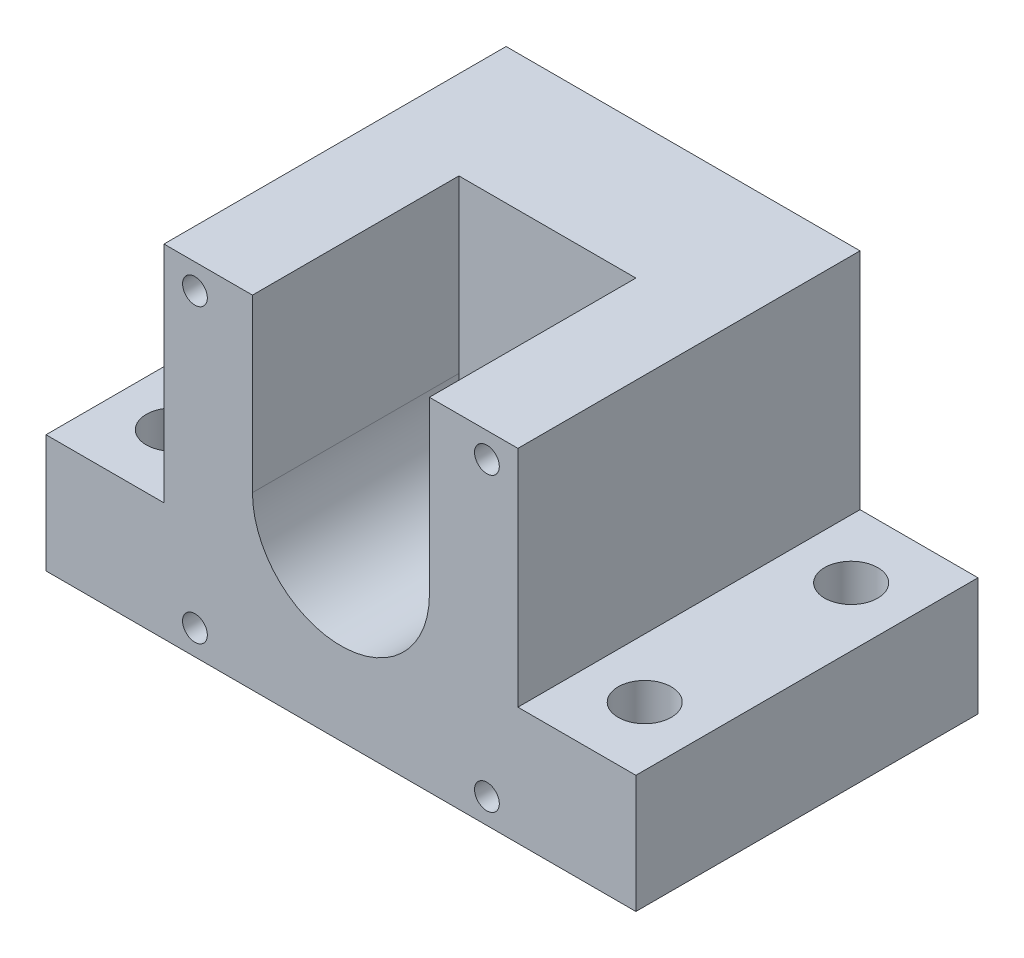
ISO-10303-21;
HEADER;
FILE_DESCRIPTION(('STEP AP214'),'2;1');
FILE_NAME('part.step','',(''),(''),'','','');
FILE_SCHEMA(('AUTOMOTIVE_DESIGN { 1 0 10303 214 1 1 1 1 }'));
ENDSEC;
DATA;
#1=APPLICATION_CONTEXT('core data for automotive mechanical design processes');
#2=APPLICATION_PROTOCOL_DEFINITION('international standard','automotive_design',2000,#1);
#3=PRODUCT_CONTEXT('',#1,'mechanical');
#4=PRODUCT('Part','Part','',(#3));
#5=PRODUCT_RELATED_PRODUCT_CATEGORY('part','',(#4));
#6=PRODUCT_DEFINITION_FORMATION('','',#4);
#7=PRODUCT_DEFINITION_CONTEXT('part definition',#1,'design');
#8=PRODUCT_DEFINITION('design','',#6,#7);
#9=PRODUCT_DEFINITION_SHAPE('','',#8);
#10=(LENGTH_UNIT() NAMED_UNIT(*) SI_UNIT(.MILLI.,.METRE.));
#11=(NAMED_UNIT(*) PLANE_ANGLE_UNIT() SI_UNIT($,.RADIAN.));
#12=(NAMED_UNIT(*) SI_UNIT($,.STERADIAN.) SOLID_ANGLE_UNIT());
#13=UNCERTAINTY_MEASURE_WITH_UNIT(LENGTH_MEASURE(1.E-05),#10,'distance_accuracy_value','');
#14=(GEOMETRIC_REPRESENTATION_CONTEXT(3) GLOBAL_UNCERTAINTY_ASSIGNED_CONTEXT((#13)) GLOBAL_UNIT_ASSIGNED_CONTEXT((#10,
#11,#12)) REPRESENTATION_CONTEXT('',''));
#15=CARTESIAN_POINT('',(0.,0.,0.));
#16=DIRECTION('',(0.,0.,1.));
#17=DIRECTION('',(1.,0.,0.));
#18=AXIS2_PLACEMENT_3D('',#15,#16,#17);
#19=CARTESIAN_POINT('',(50.,58.,0.));
#20=DIRECTION('',(-1.,0.,0.));
#21=DIRECTION('',(0.,0.,1.));
#22=AXIS2_PLACEMENT_3D('',#19,#20,#21);
#23=PLANE('',#22);
#24=DIRECTION('',(0.,0.,1.));
#25=VECTOR('',#24,1.);
#26=CARTESIAN_POINT('',(50.,20.,-58.));
#27=LINE('',#26,#25);
#28=CARTESIAN_POINT('',(50.,20.,-58.));
#29=VERTEX_POINT('',#28);
#30=CARTESIAN_POINT('',(50.,20.,0.));
#31=VERTEX_POINT('',#30);
#32=EDGE_CURVE('E175',#29,#31,#27,.T.);
#33=ORIENTED_EDGE('',*,*,#32,.T.);
#34=DIRECTION('',(0.,-1.,0.));
#35=VECTOR('',#34,1.);
#36=CARTESIAN_POINT('',(50.,58.,0.));
#37=LINE('',#36,#35);
#38=CARTESIAN_POINT('',(50.,0.,0.));
#39=VERTEX_POINT('',#38);
#40=EDGE_CURVE('E44',#31,#39,#37,.T.);
#41=ORIENTED_EDGE('',*,*,#40,.T.);
#42=DIRECTION('',(0.,0.,-1.));
#43=VECTOR('',#42,1.);
#44=CARTESIAN_POINT('',(50.,0.,0.));
#45=LINE('',#44,#43);
#46=CARTESIAN_POINT('',(50.,0.,-58.));
#47=VERTEX_POINT('',#46);
#48=EDGE_CURVE('E150',#39,#47,#45,.T.);
#49=ORIENTED_EDGE('',*,*,#48,.T.);
#50=DIRECTION('',(0.,-1.,0.));
#51=VECTOR('',#50,1.);
#52=CARTESIAN_POINT('',(50.,58.,-58.));
#53=LINE('',#52,#51);
#54=EDGE_CURVE('E168',#29,#47,#53,.T.);
#55=ORIENTED_EDGE('',*,*,#54,.F.);
#56=EDGE_LOOP('',(#33,#41,#49,#55));
#57=FACE_BOUND('',#56,.T.);
#58=ADVANCED_FACE('F35',(#57),#23,.F.);
#59=CARTESIAN_POINT('',(-50.,58.,-58.));
#60=DIRECTION('',(1.,0.,0.));
#61=DIRECTION('',(0.,0.,-1.));
#62=AXIS2_PLACEMENT_3D('',#59,#60,#61);
#63=PLANE('',#62);
#64=DIRECTION('',(0.,0.,-1.));
#65=VECTOR('',#64,1.);
#66=CARTESIAN_POINT('',(-50.,20.,-58.));
#67=LINE('',#66,#65);
#68=CARTESIAN_POINT('',(-50.,20.,0.));
#69=VERTEX_POINT('',#68);
#70=CARTESIAN_POINT('',(-50.,20.,-58.));
#71=VERTEX_POINT('',#70);
#72=EDGE_CURVE('E204',#69,#71,#67,.T.);
#73=ORIENTED_EDGE('',*,*,#72,.T.);
#74=DIRECTION('',(0.,-1.,0.));
#75=VECTOR('',#74,1.);
#76=CARTESIAN_POINT('',(-50.,58.,-58.));
#77=LINE('',#76,#75);
#78=CARTESIAN_POINT('',(-50.,0.,-58.));
#79=VERTEX_POINT('',#78);
#80=EDGE_CURVE('E157',#71,#79,#77,.T.);
#81=ORIENTED_EDGE('',*,*,#80,.T.);
#82=DIRECTION('',(0.,0.,1.));
#83=VECTOR('',#82,1.);
#84=CARTESIAN_POINT('',(-50.,0.,-58.));
#85=LINE('',#84,#83);
#86=CARTESIAN_POINT('',(-50.,0.,0.));
#87=VERTEX_POINT('',#86);
#88=EDGE_CURVE('E158',#79,#87,#85,.T.);
#89=ORIENTED_EDGE('',*,*,#88,.T.);
#90=DIRECTION('',(0.,-1.,0.));
#91=VECTOR('',#90,1.);
#92=CARTESIAN_POINT('',(-50.,58.,0.));
#93=LINE('',#92,#91);
#94=EDGE_CURVE('E12',#69,#87,#93,.T.);
#95=ORIENTED_EDGE('',*,*,#94,.F.);
#96=EDGE_LOOP('',(#73,#81,#89,#95));
#97=FACE_BOUND('',#96,.T.);
#98=ADVANCED_FACE('F37',(#97),#63,.F.);
#99=CARTESIAN_POINT('',(0.,29.,-87.4264068711929));
#100=DIRECTION('',(0.,0.,1.));
#101=DIRECTION('',(1.,0.,0.));
#102=AXIS2_PLACEMENT_3D('',#99,#100,#101);
#103=CYLINDRICAL_SURFACE('',#102,15.);
#104=DIRECTION('',(0.,0.,1.));
#105=VECTOR('',#104,1.);
#106=CARTESIAN_POINT('',(-15.,29.,-76.7252920900501));
#107=LINE('',#106,#105);
#108=CARTESIAN_POINT('',(-15.,29.,-35.));
#109=VERTEX_POINT('',#108);
#110=CARTESIAN_POINT('',(-15.,29.,0.));
#111=VERTEX_POINT('',#110);
#112=EDGE_CURVE('E241',#109,#111,#107,.T.);
#113=ORIENTED_EDGE('',*,*,#112,.T.);
#114=CARTESIAN_POINT('',(0.,29.,0.));
#115=DIRECTION('',(0.,0.,1.));
#116=DIRECTION('',(1.,0.,0.));
#117=AXIS2_PLACEMENT_3D('',#114,#115,#116);
#118=CIRCLE('',#117,15.);
#119=CARTESIAN_POINT('',(15.,29.,0.));
#120=VERTEX_POINT('',#119);
#121=EDGE_CURVE('E256',#111,#120,#118,.T.);
#122=ORIENTED_EDGE('',*,*,#121,.T.);
#123=DIRECTION('',(0.,0.,1.));
#124=VECTOR('',#123,1.);
#125=CARTESIAN_POINT('',(15.,29.,-76.7252920900501));
#126=LINE('',#125,#124);
#127=CARTESIAN_POINT('',(15.,29.,-35.));
#128=VERTEX_POINT('',#127);
#129=EDGE_CURVE('E247',#128,#120,#126,.T.);
#130=ORIENTED_EDGE('',*,*,#129,.F.);
#131=CARTESIAN_POINT('',(0.,29.,-35.));
#132=DIRECTION('',(0.,0.,1.));
#133=DIRECTION('',(1.,0.,0.));
#134=AXIS2_PLACEMENT_3D('',#131,#132,#133);
#135=CIRCLE('',#134,15.);
#136=EDGE_CURVE('E259',#128,#109,#135,.F.);
#137=ORIENTED_EDGE('',*,*,#136,.T.);
#138=EDGE_LOOP('',(#113,#122,#130,#137));
#139=FACE_BOUND('',#138,.T.);
#140=ADVANCED_FACE('F289',(#139),#103,.F.);
#141=CARTESIAN_POINT('',(0.,29.,0.));
#142=DIRECTION('',(0.,0.,-1.));
#143=DIRECTION('',(-1.,0.,0.));
#144=AXIS2_PLACEMENT_3D('',#141,#142,#143);
#145=CYLINDRICAL_SURFACE('',#144,8.);
#146=CARTESIAN_POINT('',(0.,29.,-45.));
#147=DIRECTION('',(0.,0.,-1.));
#148=DIRECTION('',(-1.,0.,0.));
#149=AXIS2_PLACEMENT_3D('',#146,#147,#148);
#150=CIRCLE('',#149,8.);
#151=CARTESIAN_POINT('',(-8.,29.,-45.));
#152=VERTEX_POINT('',#151);
#153=EDGE_CURVE('E262',#152,#152,#150,.T.);
#154=ORIENTED_EDGE('',*,*,#153,.T.);
#155=EDGE_LOOP('',(#154));
#156=FACE_BOUND('',#155,.T.);
#157=CARTESIAN_POINT('',(0.,29.,-35.));
#158=DIRECTION('',(0.,0.,1.));
#159=DIRECTION('',(1.,0.,0.));
#160=AXIS2_PLACEMENT_3D('',#157,#158,#159);
#161=CIRCLE('',#160,8.);
#162=CARTESIAN_POINT('',(8.00000000000001,29.,-35.));
#163=VERTEX_POINT('',#162);
#164=EDGE_CURVE('E39',#163,#163,#161,.F.);
#165=ORIENTED_EDGE('',*,*,#164,.F.);
#166=EDGE_LOOP('',(#165));
#167=FACE_BOUND('',#166,.T.);
#168=ADVANCED_FACE('F298',(#156,#167),#145,.F.);
#169=CARTESIAN_POINT('',(50.,58.,-58.));
#170=DIRECTION('',(0.,0.,1.));
#171=DIRECTION('',(1.,0.,0.));
#172=AXIS2_PLACEMENT_3D('',#169,#170,#171);
#173=PLANE('',#172);
#174=CARTESIAN_POINT('',(24.7487373415298,53.7487373415202,-58.));
#175=DIRECTION('',(0.,0.,1.));
#176=DIRECTION('',(1.,0.,0.));
#177=AXIS2_PLACEMENT_3D('',#174,#175,#176);
#178=CIRCLE('',#177,2.09999999999999);
#179=CARTESIAN_POINT('',(26.8487373415298,53.7487373415202,-58.));
#180=VERTEX_POINT('',#179);
#181=EDGE_CURVE('E216',#180,#180,#178,.T.);
#182=ORIENTED_EDGE('',*,*,#181,.T.);
#183=EDGE_LOOP('',(#182));
#184=FACE_BOUND('',#183,.T.);
#185=CARTESIAN_POINT('',(-24.7487373415302,53.7487373415202,-58.));
#186=DIRECTION('',(0.,0.,1.));
#187=DIRECTION('',(1.,0.,0.));
#188=AXIS2_PLACEMENT_3D('',#185,#186,#187);
#189=CIRCLE('',#188,2.09999999999999);
#190=CARTESIAN_POINT('',(-22.6487373415302,53.7487373415202,-58.));
#191=VERTEX_POINT('',#190);
#192=EDGE_CURVE('E222',#191,#191,#189,.T.);
#193=ORIENTED_EDGE('',*,*,#192,.T.);
#194=EDGE_LOOP('',(#193));
#195=FACE_BOUND('',#194,.T.);
#196=CARTESIAN_POINT('',(-24.7487373415302,4.25126265847026,-58.));
#197=DIRECTION('',(0.,0.,1.));
#198=DIRECTION('',(1.,0.,0.));
#199=AXIS2_PLACEMENT_3D('',#196,#197,#198);
#200=CIRCLE('',#199,2.09999999999999);
#201=CARTESIAN_POINT('',(-22.6487373415302,4.25126265847026,-58.));
#202=VERTEX_POINT('',#201);
#203=EDGE_CURVE('E228',#202,#202,#200,.T.);
#204=ORIENTED_EDGE('',*,*,#203,.T.);
#205=EDGE_LOOP('',(#204));
#206=FACE_BOUND('',#205,.T.);
#207=CARTESIAN_POINT('',(24.7487373415298,4.25126265847026,-58.));
#208=DIRECTION('',(0.,0.,1.));
#209=DIRECTION('',(1.,0.,0.));
#210=AXIS2_PLACEMENT_3D('',#207,#208,#209);
#211=CIRCLE('',#210,2.09999999999999);
#212=CARTESIAN_POINT('',(26.8487373415298,4.25126265847026,-58.));
#213=VERTEX_POINT('',#212);
#214=EDGE_CURVE('E234',#213,#213,#211,.T.);
#215=ORIENTED_EDGE('',*,*,#214,.T.);
#216=EDGE_LOOP('',(#215));
#217=FACE_BOUND('',#216,.T.);
#218=DIRECTION('',(-1.,0.,0.));
#219=VECTOR('',#218,1.);
#220=CARTESIAN_POINT('',(50.,58.,-58.));
#221=LINE('',#220,#219);
#222=CARTESIAN_POINT('',(30.,58.,-58.));
#223=VERTEX_POINT('',#222);
#224=CARTESIAN_POINT('',(-30.,58.,-58.));
#225=VERTEX_POINT('',#224);
#226=EDGE_CURVE('E148',#223,#225,#221,.T.);
#227=ORIENTED_EDGE('',*,*,#226,.F.);
#228=DIRECTION('',(0.,1.,0.));
#229=VECTOR('',#228,1.);
#230=CARTESIAN_POINT('',(30.,-61.3514466007119,-58.));
#231=LINE('',#230,#229);
#232=CARTESIAN_POINT('',(30.,20.,-58.));
#233=VERTEX_POINT('',#232);
#234=EDGE_CURVE('E51',#233,#223,#231,.T.);
#235=ORIENTED_EDGE('',*,*,#234,.F.);
#236=DIRECTION('',(1.,0.,0.));
#237=VECTOR('',#236,1.);
#238=CARTESIAN_POINT('',(50.,20.,-58.));
#239=LINE('',#238,#237);
#240=EDGE_CURVE('E189',#233,#29,#239,.T.);
#241=ORIENTED_EDGE('',*,*,#240,.T.);
#242=ORIENTED_EDGE('',*,*,#54,.T.);
#243=DIRECTION('',(-1.,0.,0.));
#244=VECTOR('',#243,1.);
#245=CARTESIAN_POINT('',(50.,0.,-58.));
#246=LINE('',#245,#244);
#247=EDGE_CURVE('E146',#47,#79,#246,.T.);
#248=ORIENTED_EDGE('',*,*,#247,.T.);
#249=ORIENTED_EDGE('',*,*,#80,.F.);
#250=DIRECTION('',(1.,0.,0.));
#251=VECTOR('',#250,1.);
#252=CARTESIAN_POINT('',(-50.,20.,-58.));
#253=LINE('',#252,#251);
#254=CARTESIAN_POINT('',(-30.,20.,-58.));
#255=VERTEX_POINT('',#254);
#256=EDGE_CURVE('E201',#71,#255,#253,.T.);
#257=ORIENTED_EDGE('',*,*,#256,.T.);
#258=DIRECTION('',(0.,1.,0.));
#259=VECTOR('',#258,1.);
#260=CARTESIAN_POINT('',(-30.,-61.3514466007119,-58.));
#261=LINE('',#260,#259);
#262=EDGE_CURVE('E202',#255,#225,#261,.T.);
#263=ORIENTED_EDGE('',*,*,#262,.T.);
#264=EDGE_LOOP('',(#227,#235,#241,#242,#248,#249,#257,#263));
#265=FACE_BOUND('',#264,.T.);
#266=CARTESIAN_POINT('',(0.,29.,-58.));
#267=DIRECTION('',(0.,0.,1.));
#268=DIRECTION('',(1.,0.,0.));
#269=AXIS2_PLACEMENT_3D('',#266,#267,#268);
#270=CIRCLE('',#269,11.);
#271=CARTESIAN_POINT('',(-11.,29.,-58.));
#272=VERTEX_POINT('',#271);
#273=EDGE_CURVE('E154',#272,#272,#270,.T.);
#274=ORIENTED_EDGE('',*,*,#273,.T.);
#275=EDGE_LOOP('',(#274));
#276=FACE_BOUND('',#275,.T.);
#277=ADVANCED_FACE('F184',(#184,#195,#206,#217,#265,#276),#173,.F.);
#278=CARTESIAN_POINT('',(0.,58.,0.));
#279=DIRECTION('',(0.,0.,-1.));
#280=DIRECTION('',(-1.,0.,0.));
#281=AXIS2_PLACEMENT_3D('',#278,#279,#280);
#282=PLANE('',#281);
#283=CARTESIAN_POINT('',(24.7487373415298,53.7487373415202,0.));
#284=DIRECTION('',(0.,0.,1.));
#285=DIRECTION('',(1.,0.,0.));
#286=AXIS2_PLACEMENT_3D('',#283,#284,#285);
#287=CIRCLE('',#286,2.09999999999999);
#288=CARTESIAN_POINT('',(26.8487373415298,53.7487373415202,0.));
#289=VERTEX_POINT('',#288);
#290=EDGE_CURVE('E213',#289,#289,#287,.T.);
#291=ORIENTED_EDGE('',*,*,#290,.F.);
#292=EDGE_LOOP('',(#291));
#293=FACE_BOUND('',#292,.T.);
#294=CARTESIAN_POINT('',(-24.7487373415302,53.7487373415202,0.));
#295=DIRECTION('',(0.,0.,1.));
#296=DIRECTION('',(1.,0.,0.));
#297=AXIS2_PLACEMENT_3D('',#294,#295,#296);
#298=CIRCLE('',#297,2.09999999999999);
#299=CARTESIAN_POINT('',(-22.6487373415302,53.7487373415202,0.));
#300=VERTEX_POINT('',#299);
#301=EDGE_CURVE('E219',#300,#300,#298,.T.);
#302=ORIENTED_EDGE('',*,*,#301,.F.);
#303=EDGE_LOOP('',(#302));
#304=FACE_BOUND('',#303,.T.);
#305=CARTESIAN_POINT('',(-24.7487373415302,4.25126265847026,0.));
#306=DIRECTION('',(0.,0.,1.));
#307=DIRECTION('',(1.,0.,0.));
#308=AXIS2_PLACEMENT_3D('',#305,#306,#307);
#309=CIRCLE('',#308,2.09999999999999);
#310=CARTESIAN_POINT('',(-22.6487373415302,4.25126265847026,0.));
#311=VERTEX_POINT('',#310);
#312=EDGE_CURVE('E225',#311,#311,#309,.T.);
#313=ORIENTED_EDGE('',*,*,#312,.F.);
#314=EDGE_LOOP('',(#313));
#315=FACE_BOUND('',#314,.T.);
#316=CARTESIAN_POINT('',(24.7487373415298,4.25126265847026,0.));
#317=DIRECTION('',(0.,0.,1.));
#318=DIRECTION('',(1.,0.,0.));
#319=AXIS2_PLACEMENT_3D('',#316,#317,#318);
#320=CIRCLE('',#319,2.09999999999999);
#321=CARTESIAN_POINT('',(26.8487373415298,4.25126265847026,0.));
#322=VERTEX_POINT('',#321);
#323=EDGE_CURVE('E231',#322,#322,#320,.T.);
#324=ORIENTED_EDGE('',*,*,#323,.F.);
#325=EDGE_LOOP('',(#324));
#326=FACE_BOUND('',#325,.T.);
#327=DIRECTION('',(-1.,0.,0.));
#328=VECTOR('',#327,1.);
#329=CARTESIAN_POINT('',(50.,20.,0.));
#330=LINE('',#329,#328);
#331=CARTESIAN_POINT('',(30.,20.,0.));
#332=VERTEX_POINT('',#331);
#333=EDGE_CURVE('E139',#31,#332,#330,.T.);
#334=ORIENTED_EDGE('',*,*,#333,.T.);
#335=DIRECTION('',(0.,1.,0.));
#336=VECTOR('',#335,1.);
#337=CARTESIAN_POINT('',(30.,-61.3514466007119,0.));
#338=LINE('',#337,#336);
#339=CARTESIAN_POINT('',(30.,58.,0.));
#340=VERTEX_POINT('',#339);
#341=EDGE_CURVE('E125',#332,#340,#338,.T.);
#342=ORIENTED_EDGE('',*,*,#341,.T.);
#343=DIRECTION('',(1.,0.,0.));
#344=VECTOR('',#343,1.);
#345=CARTESIAN_POINT('',(-50.,58.,0.));
#346=LINE('',#345,#344);
#347=CARTESIAN_POINT('',(15.,58.,0.));
#348=VERTEX_POINT('',#347);
#349=EDGE_CURVE('E137',#348,#340,#346,.T.);
#350=ORIENTED_EDGE('',*,*,#349,.F.);
#351=DIRECTION('',(0.,1.,0.));
#352=VECTOR('',#351,1.);
#353=CARTESIAN_POINT('',(15.,58.,0.));
#354=LINE('',#353,#352);
#355=EDGE_CURVE('E237',#120,#348,#354,.T.);
#356=ORIENTED_EDGE('',*,*,#355,.F.);
#357=ORIENTED_EDGE('',*,*,#121,.F.);
#358=DIRECTION('',(0.,-1.,0.));
#359=VECTOR('',#358,1.);
#360=CARTESIAN_POINT('',(-15.,29.,0.));
#361=LINE('',#360,#359);
#362=CARTESIAN_POINT('',(-15.,58.,0.));
#363=VERTEX_POINT('',#362);
#364=EDGE_CURVE('E245',#363,#111,#361,.T.);
#365=ORIENTED_EDGE('',*,*,#364,.F.);
#366=CARTESIAN_POINT('',(-30.,58.,0.));
#367=VERTEX_POINT('',#366);
#368=EDGE_CURVE('E145',#367,#363,#346,.T.);
#369=ORIENTED_EDGE('',*,*,#368,.F.);
#370=DIRECTION('',(0.,1.,0.));
#371=VECTOR('',#370,1.);
#372=CARTESIAN_POINT('',(-30.,-61.3514466007119,0.));
#373=LINE('',#372,#371);
#374=CARTESIAN_POINT('',(-30.,20.,0.));
#375=VERTEX_POINT('',#374);
#376=EDGE_CURVE('E59',#375,#367,#373,.T.);
#377=ORIENTED_EDGE('',*,*,#376,.F.);
#378=DIRECTION('',(-1.,0.,0.));
#379=VECTOR('',#378,1.);
#380=CARTESIAN_POINT('',(-50.,20.,0.));
#381=LINE('',#380,#379);
#382=EDGE_CURVE('E207',#375,#69,#381,.T.);
#383=ORIENTED_EDGE('',*,*,#382,.T.);
#384=ORIENTED_EDGE('',*,*,#94,.T.);
#385=DIRECTION('',(1.,0.,0.));
#386=VECTOR('',#385,1.);
#387=CARTESIAN_POINT('',(0.,0.,0.));
#388=LINE('',#387,#386);
#389=EDGE_CURVE('E161',#87,#39,#388,.T.);
#390=ORIENTED_EDGE('',*,*,#389,.T.);
#391=ORIENTED_EDGE('',*,*,#40,.F.);
#392=EDGE_LOOP('',(#334,#342,#350,#356,#357,#365,#369,#377,#383,#384,#390,#391));
#393=FACE_BOUND('',#392,.T.);
#394=ADVANCED_FACE('F135',(#293,#304,#315,#326,#393),#282,.F.);
#395=CARTESIAN_POINT('',(0.,58.,0.));
#396=DIRECTION('',(0.,1.,0.));
#397=DIRECTION('',(0.,0.,1.));
#398=AXIS2_PLACEMENT_3D('',#395,#396,#397);
#399=PLANE('',#398);
#400=DIRECTION('',(0.,0.,1.));
#401=VECTOR('',#400,1.);
#402=CARTESIAN_POINT('',(30.,58.,-58.));
#403=LINE('',#402,#401);
#404=EDGE_CURVE('E122',#223,#340,#403,.T.);
#405=ORIENTED_EDGE('',*,*,#404,.F.);
#406=ORIENTED_EDGE('',*,*,#226,.T.);
#407=DIRECTION('',(0.,0.,-1.));
#408=VECTOR('',#407,1.);
#409=CARTESIAN_POINT('',(-30.,58.,-58.));
#410=LINE('',#409,#408);
#411=EDGE_CURVE('E193',#367,#225,#410,.T.);
#412=ORIENTED_EDGE('',*,*,#411,.F.);
#413=ORIENTED_EDGE('',*,*,#368,.T.);
#414=DIRECTION('',(0.,0.,1.));
#415=VECTOR('',#414,1.);
#416=CARTESIAN_POINT('',(-15.,58.,-76.7252920900501));
#417=LINE('',#416,#415);
#418=CARTESIAN_POINT('',(-15.,58.,-35.));
#419=VERTEX_POINT('',#418);
#420=EDGE_CURVE('E250',#419,#363,#417,.T.);
#421=ORIENTED_EDGE('',*,*,#420,.F.);
#422=DIRECTION('',(1.,0.,0.));
#423=VECTOR('',#422,1.);
#424=CARTESIAN_POINT('',(-15.,58.,-35.));
#425=LINE('',#424,#423);
#426=CARTESIAN_POINT('',(15.,58.,-35.));
#427=VERTEX_POINT('',#426);
#428=EDGE_CURVE('E238',#419,#427,#425,.T.);
#429=ORIENTED_EDGE('',*,*,#428,.T.);
#430=DIRECTION('',(0.,0.,1.));
#431=VECTOR('',#430,1.);
#432=CARTESIAN_POINT('',(15.,58.,-76.7252920900501));
#433=LINE('',#432,#431);
#434=EDGE_CURVE('E144',#427,#348,#433,.T.);
#435=ORIENTED_EDGE('',*,*,#434,.T.);
#436=ORIENTED_EDGE('',*,*,#349,.T.);
#437=EDGE_LOOP('',(#405,#406,#412,#413,#421,#429,#435,#436));
#438=FACE_BOUND('',#437,.T.);
#439=ADVANCED_FACE('F142',(#438),#399,.T.);
#440=CARTESIAN_POINT('',(0.,0.,0.));
#441=DIRECTION('',(0.,1.,0.));
#442=DIRECTION('',(0.,0.,1.));
#443=AXIS2_PLACEMENT_3D('',#440,#441,#442);
#444=PLANE('',#443);
#445=CARTESIAN_POINT('',(-40.,0.,-46.5));
#446=DIRECTION('',(0.,1.,0.));
#447=DIRECTION('',(0.,0.,1.));
#448=AXIS2_PLACEMENT_3D('',#445,#446,#447);
#449=CIRCLE('',#448,4.5);
#450=CARTESIAN_POINT('',(-40.,0.,-42.));
#451=VERTEX_POINT('',#450);
#452=EDGE_CURVE('E473',#451,#451,#449,.T.);
#453=ORIENTED_EDGE('',*,*,#452,.T.);
#454=EDGE_LOOP('',(#453));
#455=FACE_BOUND('',#454,.T.);
#456=CARTESIAN_POINT('',(-40.,0.,-11.5));
#457=DIRECTION('',(0.,1.,0.));
#458=DIRECTION('',(0.,0.,1.));
#459=AXIS2_PLACEMENT_3D('',#456,#457,#458);
#460=CIRCLE('',#459,4.5);
#461=CARTESIAN_POINT('',(-40.,0.,-7.00000000000001));
#462=VERTEX_POINT('',#461);
#463=EDGE_CURVE('E482',#462,#462,#460,.T.);
#464=ORIENTED_EDGE('',*,*,#463,.T.);
#465=EDGE_LOOP('',(#464));
#466=FACE_BOUND('',#465,.T.);
#467=CARTESIAN_POINT('',(40.,0.,-46.5));
#468=DIRECTION('',(0.,1.,0.));
#469=DIRECTION('',(0.,0.,1.));
#470=AXIS2_PLACEMENT_3D('',#467,#468,#469);
#471=CIRCLE('',#470,4.5);
#472=CARTESIAN_POINT('',(40.,0.,-42.));
#473=VERTEX_POINT('',#472);
#474=EDGE_CURVE('E488',#473,#473,#471,.T.);
#475=ORIENTED_EDGE('',*,*,#474,.T.);
#476=EDGE_LOOP('',(#475));
#477=FACE_BOUND('',#476,.T.);
#478=CARTESIAN_POINT('',(40.,0.,-11.5));
#479=DIRECTION('',(0.,1.,0.));
#480=DIRECTION('',(0.,0.,1.));
#481=AXIS2_PLACEMENT_3D('',#478,#479,#480);
#482=CIRCLE('',#481,4.5);
#483=CARTESIAN_POINT('',(40.,0.,-7.00000000000001));
#484=VERTEX_POINT('',#483);
#485=EDGE_CURVE('E130',#484,#484,#482,.T.);
#486=ORIENTED_EDGE('',*,*,#485,.T.);
#487=EDGE_LOOP('',(#486));
#488=FACE_BOUND('',#487,.T.);
#489=ORIENTED_EDGE('',*,*,#88,.F.);
#490=ORIENTED_EDGE('',*,*,#247,.F.);
#491=ORIENTED_EDGE('',*,*,#48,.F.);
#492=ORIENTED_EDGE('',*,*,#389,.F.);
#493=EDGE_LOOP('',(#489,#490,#491,#492));
#494=FACE_BOUND('',#493,.T.);
#495=ADVANCED_FACE('F181',(#455,#466,#477,#488,#494),#444,.F.);
#496=CARTESIAN_POINT('',(0.,29.,-45.));
#497=DIRECTION('',(0.,0.,-1.));
#498=DIRECTION('',(-1.,0.,0.));
#499=AXIS2_PLACEMENT_3D('',#496,#497,#498);
#500=CYLINDRICAL_SURFACE('',#499,11.);
#501=CARTESIAN_POINT('',(0.,29.,-45.));
#502=DIRECTION('',(0.,0.,1.));
#503=DIRECTION('',(1.,0.,0.));
#504=AXIS2_PLACEMENT_3D('',#501,#502,#503);
#505=CIRCLE('',#504,11.);
#506=CARTESIAN_POINT('',(-11.,29.,-45.));
#507=VERTEX_POINT('',#506);
#508=EDGE_CURVE('E162',#507,#507,#505,.T.);
#509=CARTESIAN_POINT('',(-11.,29.,-45.));
#510=CARTESIAN_POINT('',(-11.,29.,-45.1354166666667));
#511=CARTESIAN_POINT('',(-11.,29.,-45.2708333333333));
#512=CARTESIAN_POINT('',(-11.,29.,-45.5416666666667));
#513=CARTESIAN_POINT('',(-11.,29.,-45.6770833333333));
#514=CARTESIAN_POINT('',(-11.,29.,-45.9479166666667));
#515=CARTESIAN_POINT('',(-11.,29.,-46.0833333333333));
#516=CARTESIAN_POINT('',(-11.,29.,-46.3541666666667));
#517=CARTESIAN_POINT('',(-11.,29.,-46.4895833333333));
#518=CARTESIAN_POINT('',(-11.,29.,-46.7604166666667));
#519=CARTESIAN_POINT('',(-11.,29.,-46.8958333333333));
#520=CARTESIAN_POINT('',(-11.,29.,-47.1666666666667));
#521=CARTESIAN_POINT('',(-11.,29.,-47.3020833333333));
#522=CARTESIAN_POINT('',(-11.,29.,-47.5729166666667));
#523=CARTESIAN_POINT('',(-11.,29.,-47.7083333333333));
#524=CARTESIAN_POINT('',(-11.,29.,-47.9791666666667));
#525=CARTESIAN_POINT('',(-11.,29.,-48.1145833333333));
#526=CARTESIAN_POINT('',(-11.,29.,-48.3854166666667));
#527=CARTESIAN_POINT('',(-11.,29.,-48.5208333333333));
#528=CARTESIAN_POINT('',(-11.,29.,-48.7916666666667));
#529=CARTESIAN_POINT('',(-11.,29.,-48.9270833333333));
#530=CARTESIAN_POINT('',(-11.,29.,-49.1979166666667));
#531=CARTESIAN_POINT('',(-11.,29.,-49.3333333333333));
#532=CARTESIAN_POINT('',(-11.,29.,-49.6041666666667));
#533=CARTESIAN_POINT('',(-11.,29.,-49.7395833333333));
#534=CARTESIAN_POINT('',(-11.,29.,-50.0104166666667));
#535=CARTESIAN_POINT('',(-11.,29.,-50.1458333333333));
#536=CARTESIAN_POINT('',(-11.,29.,-50.4166666666667));
#537=CARTESIAN_POINT('',(-11.,29.,-50.5520833333333));
#538=CARTESIAN_POINT('',(-11.,29.,-50.8229166666667));
#539=CARTESIAN_POINT('',(-11.,29.,-50.9583333333333));
#540=CARTESIAN_POINT('',(-11.,29.,-51.2291666666667));
#541=CARTESIAN_POINT('',(-11.,29.,-51.3645833333333));
#542=CARTESIAN_POINT('',(-11.,29.,-51.6354166666667));
#543=CARTESIAN_POINT('',(-11.,29.,-51.7708333333333));
#544=CARTESIAN_POINT('',(-11.,29.,-52.0416666666667));
#545=CARTESIAN_POINT('',(-11.,29.,-52.1770833333333));
#546=CARTESIAN_POINT('',(-11.,29.,-52.4479166666667));
#547=CARTESIAN_POINT('',(-11.,29.,-52.5833333333333));
#548=CARTESIAN_POINT('',(-11.,29.,-52.8541666666667));
#549=CARTESIAN_POINT('',(-11.,29.,-52.9895833333333));
#550=CARTESIAN_POINT('',(-11.,29.,-53.2604166666667));
#551=CARTESIAN_POINT('',(-11.,29.,-53.3958333333333));
#552=CARTESIAN_POINT('',(-11.,29.,-53.6666666666667));
#553=CARTESIAN_POINT('',(-11.,29.,-53.8020833333333));
#554=CARTESIAN_POINT('',(-11.,29.,-54.0729166666667));
#555=CARTESIAN_POINT('',(-11.,29.,-54.2083333333333));
#556=CARTESIAN_POINT('',(-11.,29.,-54.4791666666667));
#557=CARTESIAN_POINT('',(-11.,29.,-54.6145833333333));
#558=CARTESIAN_POINT('',(-11.,29.,-54.8854166666667));
#559=CARTESIAN_POINT('',(-11.,29.,-55.0208333333333));
#560=CARTESIAN_POINT('',(-11.,29.,-55.2916666666667));
#561=CARTESIAN_POINT('',(-11.,29.,-55.4270833333333));
#562=CARTESIAN_POINT('',(-11.,29.,-55.6979166666667));
#563=CARTESIAN_POINT('',(-11.,29.,-55.8333333333333));
#564=CARTESIAN_POINT('',(-11.,29.,-56.1041666666667));
#565=CARTESIAN_POINT('',(-11.,29.,-56.2395833333333));
#566=CARTESIAN_POINT('',(-11.,29.,-56.5104166666667));
#567=CARTESIAN_POINT('',(-11.,29.,-56.6458333333334));
#568=CARTESIAN_POINT('',(-11.,29.,-56.9166666666667));
#569=CARTESIAN_POINT('',(-11.,29.,-57.0520833333333));
#570=CARTESIAN_POINT('',(-11.,29.,-57.3229166666667));
#571=CARTESIAN_POINT('',(-11.,29.,-57.4583333333333));
#572=CARTESIAN_POINT('',(-11.,29.,-57.7291666666667));
#573=CARTESIAN_POINT('',(-11.,29.,-57.8645833333333));
#574=CARTESIAN_POINT('',(-11.,29.,-58.));
#575=B_SPLINE_CURVE_WITH_KNOTS('',3,(#509,#510,#511,#512,#513,#514,#515,#516,#517,#518,#519,
#520,#521,#522,#523,#524,#525,#526,#527,#528,#529,#530,#531,#532,#533,#534,#535,#536,#537,#538,
#539,#540,#541,#542,#543,#544,#545,#546,#547,#548,#549,#550,#551,#552,#553,#554,#555,#556,#557,
#558,#559,#560,#561,#562,#563,#564,#565,#566,#567,#568,#569,#570,#571,#572,#573,#574),
.UNSPECIFIED.,.F.,.F.,(4,2,2,2,2,2,2,2,2,2,2,2,2,2,2,2,2,2,2,2,2,2,2,2,2,2,2,2,2,2,2,2,4),(0.,
0.406250000000004,0.812500000000001,1.21875,1.625,2.03125000000001,2.4375,2.84375000000001,3.25,
3.65625,4.0625,4.46875,4.875,5.28125,5.68750000000001,6.09375,6.50000000000001,6.90625,7.3125,
7.71875,8.125,8.53125,8.9375,9.34375000000001,9.75,10.15625,10.5625,10.96875,11.375,11.78125,
12.1875,12.59375,13.),.UNSPECIFIED.);
#576=EDGE_CURVE('BSEAM270',#507,#272,#575,.T.);
#577=ORIENTED_EDGE('',*,*,#508,.T.);
#578=ORIENTED_EDGE('',*,*,#273,.F.);
#579=ORIENTED_EDGE('',*,*,#576,.T.);
#580=ORIENTED_EDGE('',*,*,#576,.F.);
#581=EDGE_LOOP('',(#577,#579,#578,#580));
#582=FACE_BOUND('',#581,.T.);
#583=ADVANCED_FACE('F270',(#582),#500,.F.);
#584=CARTESIAN_POINT('',(0.,29.,-45.));
#585=DIRECTION('',(0.,0.,1.));
#586=DIRECTION('',(1.,0.,0.));
#587=AXIS2_PLACEMENT_3D('',#584,#585,#586);
#588=PLANE('',#587);
#589=ORIENTED_EDGE('',*,*,#153,.F.);
#590=EDGE_LOOP('',(#589));
#591=FACE_BOUND('',#590,.T.);
#592=ORIENTED_EDGE('',*,*,#508,.F.);
#593=EDGE_LOOP('',(#592));
#594=FACE_BOUND('',#593,.T.);
#595=ADVANCED_FACE('F272',(#591,#594),#588,.F.);
#596=CARTESIAN_POINT('',(0.,29.,-35.));
#597=DIRECTION('',(0.,0.,1.));
#598=DIRECTION('',(1.,0.,0.));
#599=AXIS2_PLACEMENT_3D('',#596,#597,#598);
#600=PLANE('',#599);
#601=ORIENTED_EDGE('',*,*,#164,.T.);
#602=EDGE_LOOP('',(#601));
#603=FACE_BOUND('',#602,.T.);
#604=DIRECTION('',(0.,1.,0.));
#605=VECTOR('',#604,1.);
#606=CARTESIAN_POINT('',(-15.,29.,-35.));
#607=LINE('',#606,#605);
#608=EDGE_CURVE('E240',#109,#419,#607,.T.);
#609=ORIENTED_EDGE('',*,*,#608,.F.);
#610=ORIENTED_EDGE('',*,*,#136,.F.);
#611=DIRECTION('',(0.,-1.,0.));
#612=VECTOR('',#611,1.);
#613=CARTESIAN_POINT('',(15.,58.,-35.));
#614=LINE('',#613,#612);
#615=EDGE_CURVE('E243',#427,#128,#614,.T.);
#616=ORIENTED_EDGE('',*,*,#615,.F.);
#617=ORIENTED_EDGE('',*,*,#428,.F.);
#618=EDGE_LOOP('',(#609,#610,#616,#617));
#619=FACE_BOUND('',#618,.T.);
#620=ADVANCED_FACE('F278',(#603,#619),#600,.T.);
#621=CARTESIAN_POINT('',(-15.,29.,-76.7252920900501));
#622=DIRECTION('',(-1.,0.,0.));
#623=DIRECTION('',(0.,0.,1.));
#624=AXIS2_PLACEMENT_3D('',#621,#622,#623);
#625=PLANE('',#624);
#626=ORIENTED_EDGE('',*,*,#608,.T.);
#627=ORIENTED_EDGE('',*,*,#420,.T.);
#628=ORIENTED_EDGE('',*,*,#364,.T.);
#629=ORIENTED_EDGE('',*,*,#112,.F.);
#630=EDGE_LOOP('',(#626,#627,#628,#629));
#631=FACE_BOUND('',#630,.T.);
#632=ADVANCED_FACE('F321',(#631),#625,.F.);
#633=CARTESIAN_POINT('',(15.,58.,-76.7252920900501));
#634=DIRECTION('',(1.,0.,0.));
#635=DIRECTION('',(0.,0.,-1.));
#636=AXIS2_PLACEMENT_3D('',#633,#634,#635);
#637=PLANE('',#636);
#638=ORIENTED_EDGE('',*,*,#615,.T.);
#639=ORIENTED_EDGE('',*,*,#129,.T.);
#640=ORIENTED_EDGE('',*,*,#355,.T.);
#641=ORIENTED_EDGE('',*,*,#434,.F.);
#642=EDGE_LOOP('',(#638,#639,#640,#641));
#643=FACE_BOUND('',#642,.T.);
#644=ADVANCED_FACE('F311',(#643),#637,.F.);
#645=CARTESIAN_POINT('',(24.7487373415298,4.25126265847026,0.));
#646=DIRECTION('',(0.,0.,1.));
#647=DIRECTION('',(1.,0.,0.));
#648=AXIS2_PLACEMENT_3D('',#645,#646,#647);
#649=CYLINDRICAL_SURFACE('',#648,2.09999999999999);
#650=ORIENTED_EDGE('',*,*,#214,.F.);
#651=EDGE_LOOP('',(#650));
#652=FACE_BOUND('',#651,.T.);
#653=ORIENTED_EDGE('',*,*,#323,.T.);
#654=EDGE_LOOP('',(#653));
#655=FACE_BOUND('',#654,.T.);
#656=ADVANCED_FACE('F308',(#652,#655),#649,.F.);
#657=CARTESIAN_POINT('',(-24.7487373415302,4.25126265847026,0.));
#658=DIRECTION('',(0.,0.,1.));
#659=DIRECTION('',(1.,0.,0.));
#660=AXIS2_PLACEMENT_3D('',#657,#658,#659);
#661=CYLINDRICAL_SURFACE('',#660,2.09999999999999);
#662=ORIENTED_EDGE('',*,*,#203,.F.);
#663=EDGE_LOOP('',(#662));
#664=FACE_BOUND('',#663,.T.);
#665=ORIENTED_EDGE('',*,*,#312,.T.);
#666=EDGE_LOOP('',(#665));
#667=FACE_BOUND('',#666,.T.);
#668=ADVANCED_FACE('F310',(#664,#667),#661,.F.);
#669=CARTESIAN_POINT('',(-24.7487373415302,53.7487373415202,0.));
#670=DIRECTION('',(0.,0.,1.));
#671=DIRECTION('',(1.,0.,0.));
#672=AXIS2_PLACEMENT_3D('',#669,#670,#671);
#673=CYLINDRICAL_SURFACE('',#672,2.09999999999999);
#674=ORIENTED_EDGE('',*,*,#192,.F.);
#675=EDGE_LOOP('',(#674));
#676=FACE_BOUND('',#675,.T.);
#677=ORIENTED_EDGE('',*,*,#301,.T.);
#678=EDGE_LOOP('',(#677));
#679=FACE_BOUND('',#678,.T.);
#680=ADVANCED_FACE('F318',(#676,#679),#673,.F.);
#681=CARTESIAN_POINT('',(24.7487373415298,53.7487373415202,0.));
#682=DIRECTION('',(0.,0.,1.));
#683=DIRECTION('',(1.,0.,0.));
#684=AXIS2_PLACEMENT_3D('',#681,#682,#683);
#685=CYLINDRICAL_SURFACE('',#684,2.09999999999999);
#686=ORIENTED_EDGE('',*,*,#181,.F.);
#687=EDGE_LOOP('',(#686));
#688=FACE_BOUND('',#687,.T.);
#689=ORIENTED_EDGE('',*,*,#290,.T.);
#690=EDGE_LOOP('',(#689));
#691=FACE_BOUND('',#690,.T.);
#692=ADVANCED_FACE('F368',(#688,#691),#685,.F.);
#693=CARTESIAN_POINT('',(-30.,-61.3514466007119,-58.));
#694=DIRECTION('',(1.,0.,0.));
#695=DIRECTION('',(0.,0.,-1.));
#696=AXIS2_PLACEMENT_3D('',#693,#694,#695);
#697=PLANE('',#696);
#698=DIRECTION('',(0.,0.,1.));
#699=VECTOR('',#698,1.);
#700=CARTESIAN_POINT('',(-30.,20.,-58.));
#701=LINE('',#700,#699);
#702=EDGE_CURVE('E199',#255,#375,#701,.T.);
#703=ORIENTED_EDGE('',*,*,#702,.T.);
#704=ORIENTED_EDGE('',*,*,#376,.T.);
#705=ORIENTED_EDGE('',*,*,#411,.T.);
#706=ORIENTED_EDGE('',*,*,#262,.F.);
#707=EDGE_LOOP('',(#703,#704,#705,#706));
#708=FACE_BOUND('',#707,.T.);
#709=ADVANCED_FACE('F355',(#708),#697,.F.);
#710=CARTESIAN_POINT('',(0.,20.,0.));
#711=DIRECTION('',(0.,1.,0.));
#712=DIRECTION('',(0.,0.,1.));
#713=AXIS2_PLACEMENT_3D('',#710,#711,#712);
#714=PLANE('',#713);
#715=CARTESIAN_POINT('',(-40.,20.,-46.5));
#716=DIRECTION('',(0.,1.,0.));
#717=DIRECTION('',(0.,0.,1.));
#718=AXIS2_PLACEMENT_3D('',#715,#716,#717);
#719=CIRCLE('',#718,4.49999999999999);
#720=CARTESIAN_POINT('',(-40.,20.,-42.));
#721=VERTEX_POINT('',#720);
#722=EDGE_CURVE('E475',#721,#721,#719,.T.);
#723=ORIENTED_EDGE('',*,*,#722,.F.);
#724=EDGE_LOOP('',(#723));
#725=FACE_BOUND('',#724,.T.);
#726=CARTESIAN_POINT('',(-40.,20.,-11.5));
#727=DIRECTION('',(0.,1.,0.));
#728=DIRECTION('',(0.,0.,1.));
#729=AXIS2_PLACEMENT_3D('',#726,#727,#728);
#730=CIRCLE('',#729,4.49999999999999);
#731=CARTESIAN_POINT('',(-40.,20.,-7.00000000000002));
#732=VERTEX_POINT('',#731);
#733=EDGE_CURVE('E477',#732,#732,#730,.T.);
#734=ORIENTED_EDGE('',*,*,#733,.F.);
#735=EDGE_LOOP('',(#734));
#736=FACE_BOUND('',#735,.T.);
#737=ORIENTED_EDGE('',*,*,#72,.F.);
#738=ORIENTED_EDGE('',*,*,#382,.F.);
#739=ORIENTED_EDGE('',*,*,#702,.F.);
#740=ORIENTED_EDGE('',*,*,#256,.F.);
#741=EDGE_LOOP('',(#737,#738,#739,#740));
#742=FACE_BOUND('',#741,.T.);
#743=ADVANCED_FACE('F357',(#725,#736,#742),#714,.T.);
#744=CARTESIAN_POINT('',(30.,-61.3514466007119,-58.));
#745=DIRECTION('',(-1.,0.,0.));
#746=DIRECTION('',(0.,0.,1.));
#747=AXIS2_PLACEMENT_3D('',#744,#745,#746);
#748=PLANE('',#747);
#749=DIRECTION('',(0.,0.,-1.));
#750=VECTOR('',#749,1.);
#751=CARTESIAN_POINT('',(30.,20.,-58.));
#752=LINE('',#751,#750);
#753=EDGE_CURVE('E191',#332,#233,#752,.T.);
#754=ORIENTED_EDGE('',*,*,#753,.T.);
#755=ORIENTED_EDGE('',*,*,#234,.T.);
#756=ORIENTED_EDGE('',*,*,#404,.T.);
#757=ORIENTED_EDGE('',*,*,#341,.F.);
#758=EDGE_LOOP('',(#754,#755,#756,#757));
#759=FACE_BOUND('',#758,.T.);
#760=ADVANCED_FACE('F124',(#759),#748,.F.);
#761=CARTESIAN_POINT('',(0.,20.,0.));
#762=DIRECTION('',(0.,1.,0.));
#763=DIRECTION('',(0.,0.,1.));
#764=AXIS2_PLACEMENT_3D('',#761,#762,#763);
#765=PLANE('',#764);
#766=CARTESIAN_POINT('',(40.,20.,-46.5));
#767=DIRECTION('',(0.,1.,0.));
#768=DIRECTION('',(0.,0.,1.));
#769=AXIS2_PLACEMENT_3D('',#766,#767,#768);
#770=CIRCLE('',#769,4.49999999999999);
#771=CARTESIAN_POINT('',(40.,20.,-42.));
#772=VERTEX_POINT('',#771);
#773=EDGE_CURVE('E485',#772,#772,#770,.T.);
#774=ORIENTED_EDGE('',*,*,#773,.F.);
#775=EDGE_LOOP('',(#774));
#776=FACE_BOUND('',#775,.T.);
#777=CARTESIAN_POINT('',(40.,20.,-11.5));
#778=DIRECTION('',(0.,1.,0.));
#779=DIRECTION('',(0.,0.,1.));
#780=AXIS2_PLACEMENT_3D('',#777,#778,#779);
#781=CIRCLE('',#780,4.49999999999999);
#782=CARTESIAN_POINT('',(40.,20.,-7.00000000000002));
#783=VERTEX_POINT('',#782);
#784=EDGE_CURVE('E491',#783,#783,#781,.T.);
#785=ORIENTED_EDGE('',*,*,#784,.F.);
#786=EDGE_LOOP('',(#785));
#787=FACE_BOUND('',#786,.T.);
#788=ORIENTED_EDGE('',*,*,#240,.F.);
#789=ORIENTED_EDGE('',*,*,#753,.F.);
#790=ORIENTED_EDGE('',*,*,#333,.F.);
#791=ORIENTED_EDGE('',*,*,#32,.F.);
#792=EDGE_LOOP('',(#788,#789,#790,#791));
#793=FACE_BOUND('',#792,.T.);
#794=ADVANCED_FACE('F366',(#776,#787,#793),#765,.T.);
#795=CARTESIAN_POINT('',(40.,20.,-11.5));
#796=DIRECTION('',(0.,1.,0.));
#797=DIRECTION('',(0.,0.,1.));
#798=AXIS2_PLACEMENT_3D('',#795,#796,#797);
#799=CYLINDRICAL_SURFACE('',#798,4.49999999999999);
#800=ORIENTED_EDGE('',*,*,#485,.F.);
#801=EDGE_LOOP('',(#800));
#802=FACE_BOUND('',#801,.T.);
#803=ORIENTED_EDGE('',*,*,#784,.T.);
#804=EDGE_LOOP('',(#803));
#805=FACE_BOUND('',#804,.T.);
#806=ADVANCED_FACE('F427',(#802,#805),#799,.F.);
#807=CARTESIAN_POINT('',(40.,20.,-46.5));
#808=DIRECTION('',(0.,1.,0.));
#809=DIRECTION('',(0.,0.,1.));
#810=AXIS2_PLACEMENT_3D('',#807,#808,#809);
#811=CYLINDRICAL_SURFACE('',#810,4.49999999999999);
#812=ORIENTED_EDGE('',*,*,#474,.F.);
#813=EDGE_LOOP('',(#812));
#814=FACE_BOUND('',#813,.T.);
#815=ORIENTED_EDGE('',*,*,#773,.T.);
#816=EDGE_LOOP('',(#815));
#817=FACE_BOUND('',#816,.T.);
#818=ADVANCED_FACE('F436',(#814,#817),#811,.F.);
#819=CARTESIAN_POINT('',(-40.,20.,-11.5));
#820=DIRECTION('',(0.,1.,0.));
#821=DIRECTION('',(0.,0.,1.));
#822=AXIS2_PLACEMENT_3D('',#819,#820,#821);
#823=CYLINDRICAL_SURFACE('',#822,4.49999999999999);
#824=ORIENTED_EDGE('',*,*,#463,.F.);
#825=EDGE_LOOP('',(#824));
#826=FACE_BOUND('',#825,.T.);
#827=ORIENTED_EDGE('',*,*,#733,.T.);
#828=EDGE_LOOP('',(#827));
#829=FACE_BOUND('',#828,.T.);
#830=ADVANCED_FACE('F446',(#826,#829),#823,.F.);
#831=CARTESIAN_POINT('',(-40.,20.,-46.5));
#832=DIRECTION('',(0.,1.,0.));
#833=DIRECTION('',(0.,0.,1.));
#834=AXIS2_PLACEMENT_3D('',#831,#832,#833);
#835=CYLINDRICAL_SURFACE('',#834,4.49999999999999);
#836=ORIENTED_EDGE('',*,*,#452,.F.);
#837=EDGE_LOOP('',(#836));
#838=FACE_BOUND('',#837,.T.);
#839=ORIENTED_EDGE('',*,*,#722,.T.);
#840=EDGE_LOOP('',(#839));
#841=FACE_BOUND('',#840,.T.);
#842=ADVANCED_FACE('F456',(#838,#841),#835,.F.);
#843=CLOSED_SHELL('',(#58,#98,#140,#168,#277,#394,#439,#495,#583,#595,#620,#632,#644,#656,#668,
#680,#692,#709,#743,#760,#794,#806,#818,#830,#842));
#844=MANIFOLD_SOLID_BREP('B2',#843);
#845=ADVANCED_BREP_SHAPE_REPRESENTATION('',(#18,#844),#14);
#846=SHAPE_DEFINITION_REPRESENTATION(#9,#845);
ENDSEC;
END-ISO-10303-21;
